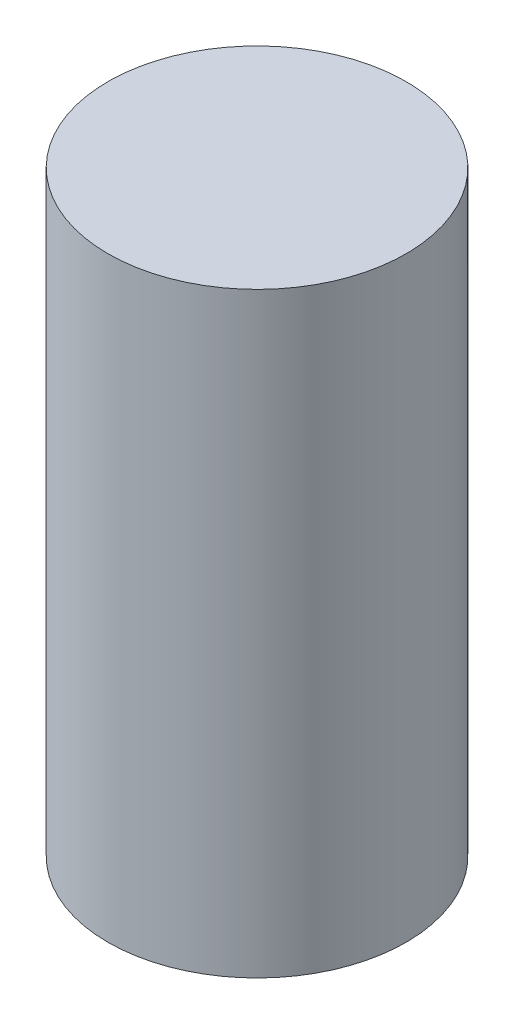
ISO-10303-21;
HEADER;
FILE_DESCRIPTION(('STEP AP214'),'2;1');
FILE_NAME('part.step','',(''),(''),'','','');
FILE_SCHEMA(('AUTOMOTIVE_DESIGN { 1 0 10303 214 1 1 1 1 }'));
ENDSEC;
DATA;
#1=APPLICATION_CONTEXT('core data for automotive mechanical design processes');
#2=APPLICATION_PROTOCOL_DEFINITION('international standard','automotive_design',2000,#1);
#3=PRODUCT_CONTEXT('',#1,'mechanical');
#4=PRODUCT('Part','Part','',(#3));
#5=PRODUCT_RELATED_PRODUCT_CATEGORY('part','',(#4));
#6=PRODUCT_DEFINITION_FORMATION('','',#4);
#7=PRODUCT_DEFINITION_CONTEXT('part definition',#1,'design');
#8=PRODUCT_DEFINITION('design','',#6,#7);
#9=PRODUCT_DEFINITION_SHAPE('','',#8);
#10=(LENGTH_UNIT() NAMED_UNIT(*) SI_UNIT(.MILLI.,.METRE.));
#11=(NAMED_UNIT(*) PLANE_ANGLE_UNIT() SI_UNIT($,.RADIAN.));
#12=(NAMED_UNIT(*) SI_UNIT($,.STERADIAN.) SOLID_ANGLE_UNIT());
#13=UNCERTAINTY_MEASURE_WITH_UNIT(LENGTH_MEASURE(1.E-05),#10,'distance_accuracy_value','');
#14=(GEOMETRIC_REPRESENTATION_CONTEXT(3) GLOBAL_UNCERTAINTY_ASSIGNED_CONTEXT((#13)) GLOBAL_UNIT_ASSIGNED_CONTEXT((#10,
#11,#12)) REPRESENTATION_CONTEXT('',''));
#15=CARTESIAN_POINT('',(0.,0.,0.));
#16=DIRECTION('',(0.,0.,1.));
#17=DIRECTION('',(1.,0.,0.));
#18=AXIS2_PLACEMENT_3D('',#15,#16,#17);
#19=CARTESIAN_POINT('',(0.,60.,0.));
#20=DIRECTION('',(0.,-1.,0.));
#21=DIRECTION('',(0.,0.,-1.));
#22=AXIS2_PLACEMENT_3D('',#19,#20,#21);
#23=CYLINDRICAL_SURFACE('',#22,15.);
#24=CARTESIAN_POINT('',(0.,60.,0.));
#25=DIRECTION('',(0.,1.,0.));
#26=DIRECTION('',(0.,0.,1.));
#27=AXIS2_PLACEMENT_3D('',#24,#25,#26);
#28=CIRCLE('',#27,15.);
#29=CARTESIAN_POINT('',(0.,60.,15.));
#30=VERTEX_POINT('',#29);
#31=EDGE_CURVE('E10',#30,#30,#28,.T.);
#32=ORIENTED_EDGE('',*,*,#31,.F.);
#33=EDGE_LOOP('',(#32));
#34=FACE_BOUND('',#33,.T.);
#35=CARTESIAN_POINT('',(0.,0.,0.));
#36=DIRECTION('',(0.,1.,0.));
#37=DIRECTION('',(0.,0.,1.));
#38=AXIS2_PLACEMENT_3D('',#35,#36,#37);
#39=CIRCLE('',#38,15.);
#40=CARTESIAN_POINT('',(0.,0.,15.));
#41=VERTEX_POINT('',#40);
#42=EDGE_CURVE('E42',#41,#41,#39,.T.);
#43=ORIENTED_EDGE('',*,*,#42,.T.);
#44=EDGE_LOOP('',(#43));
#45=FACE_BOUND('',#44,.T.);
#46=ADVANCED_FACE('F39',(#34,#45),#23,.T.);
#47=CARTESIAN_POINT('',(0.,60.,0.));
#48=DIRECTION('',(0.,1.,0.));
#49=DIRECTION('',(0.,0.,1.));
#50=AXIS2_PLACEMENT_3D('',#47,#48,#49);
#51=PLANE('',#50);
#52=ORIENTED_EDGE('',*,*,#31,.T.);
#53=EDGE_LOOP('',(#52));
#54=FACE_BOUND('',#53,.T.);
#55=ADVANCED_FACE('F56',(#54),#51,.T.);
#56=CARTESIAN_POINT('',(0.,0.,0.));
#57=DIRECTION('',(0.,1.,0.));
#58=DIRECTION('',(0.,0.,1.));
#59=AXIS2_PLACEMENT_3D('',#56,#57,#58);
#60=PLANE('',#59);
#61=ORIENTED_EDGE('',*,*,#42,.F.);
#62=EDGE_LOOP('',(#61));
#63=FACE_BOUND('',#62,.T.);
#64=ADVANCED_FACE('F54',(#63),#60,.F.);
#65=CLOSED_SHELL('',(#46,#55,#64));
#66=MANIFOLD_SOLID_BREP('B2',#65);
#67=ADVANCED_BREP_SHAPE_REPRESENTATION('',(#18,#66),#14);
#68=SHAPE_DEFINITION_REPRESENTATION(#9,#67);
ENDSEC;
END-ISO-10303-21;
